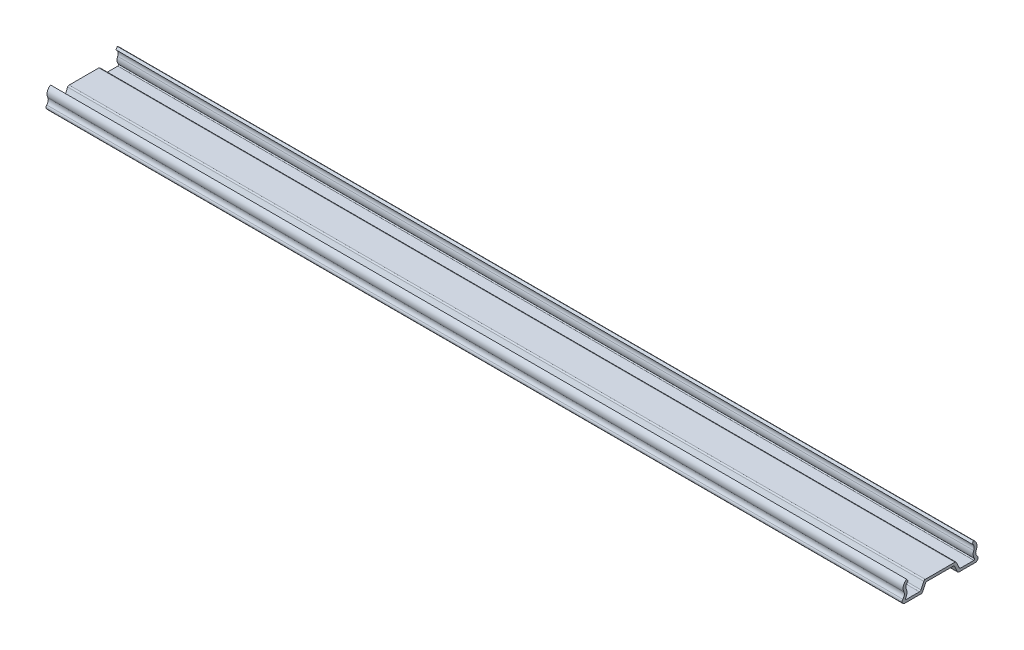
ISO-10303-21;
HEADER;
FILE_DESCRIPTION(('STEP AP214'),'2;1');
FILE_NAME('part.step','',(''),(''),'','','');
FILE_SCHEMA(('AUTOMOTIVE_DESIGN { 1 0 10303 214 1 1 1 1 }'));
ENDSEC;
DATA;
#1=APPLICATION_CONTEXT('core data for automotive mechanical design processes');
#2=APPLICATION_PROTOCOL_DEFINITION('international standard','automotive_design',2000,#1);
#3=PRODUCT_CONTEXT('',#1,'mechanical');
#4=PRODUCT('Part','Part','',(#3));
#5=PRODUCT_RELATED_PRODUCT_CATEGORY('part','',(#4));
#6=PRODUCT_DEFINITION_FORMATION('','',#4);
#7=PRODUCT_DEFINITION_CONTEXT('part definition',#1,'design');
#8=PRODUCT_DEFINITION('design','',#6,#7);
#9=PRODUCT_DEFINITION_SHAPE('','',#8);
#10=(LENGTH_UNIT() NAMED_UNIT(*) SI_UNIT(.MILLI.,.METRE.));
#11=(NAMED_UNIT(*) PLANE_ANGLE_UNIT() SI_UNIT($,.RADIAN.));
#12=(NAMED_UNIT(*) SI_UNIT($,.STERADIAN.) SOLID_ANGLE_UNIT());
#13=UNCERTAINTY_MEASURE_WITH_UNIT(LENGTH_MEASURE(1.E-05),#10,'distance_accuracy_value','');
#14=(GEOMETRIC_REPRESENTATION_CONTEXT(3) GLOBAL_UNCERTAINTY_ASSIGNED_CONTEXT((#13)) GLOBAL_UNIT_ASSIGNED_CONTEXT((#10,
#11,#12)) REPRESENTATION_CONTEXT('',''));
#15=CARTESIAN_POINT('',(0.,0.,0.));
#16=DIRECTION('',(0.,0.,1.));
#17=DIRECTION('',(1.,0.,0.));
#18=AXIS2_PLACEMENT_3D('',#15,#16,#17);
#19=CARTESIAN_POINT('',(0.,2.75348476488458,8.73241872004198));
#20=DIRECTION('',(1.,0.,0.));
#21=DIRECTION('',(0.,0.,-1.));
#22=AXIS2_PLACEMENT_3D('',#19,#20,#21);
#23=CYLINDRICAL_SURFACE('',#22,0.764864764885653);
#24=CARTESIAN_POINT('',(0.,2.75348476488458,8.73241872004198));
#25=DIRECTION('',(1.,0.,0.));
#26=DIRECTION('',(0.,0.,-1.));
#27=AXIS2_PLACEMENT_3D('',#24,#25,#26);
#28=CIRCLE('',#27,0.764864764885653);
#29=CARTESIAN_POINT('',(0.,1.98862,8.73241936002099));
#30=VERTEX_POINT('',#29);
#31=CARTESIAN_POINT('',(0.,2.43022725528312,8.03922127987804));
#32=VERTEX_POINT('',#31);
#33=EDGE_CURVE('E233',#30,#32,#28,.T.);
#34=ORIENTED_EDGE('',*,*,#33,.T.);
#35=DIRECTION('',(1.,0.,0.));
#36=VECTOR('',#35,1.);
#37=CARTESIAN_POINT('',(0.,2.43022725528312,8.03922127987804));
#38=LINE('',#37,#36);
#39=CARTESIAN_POINT('',(400.,2.43022725528312,8.03922127987804));
#40=VERTEX_POINT('',#39);
#41=EDGE_CURVE('E231',#40,#32,#38,.F.);
#42=ORIENTED_EDGE('',*,*,#41,.F.);
#43=CARTESIAN_POINT('',(400.,2.75348476488458,8.73241872004198));
#44=DIRECTION('',(1.,0.,0.));
#45=DIRECTION('',(0.,0.,-1.));
#46=AXIS2_PLACEMENT_3D('',#43,#44,#45);
#47=CIRCLE('',#46,0.764864764885653);
#48=CARTESIAN_POINT('',(400.,1.98862,8.73241936002099));
#49=VERTEX_POINT('',#48);
#50=EDGE_CURVE('E20',#40,#49,#47,.F.);
#51=ORIENTED_EDGE('',*,*,#50,.T.);
#52=DIRECTION('',(1.,0.,0.));
#53=VECTOR('',#52,1.);
#54=CARTESIAN_POINT('',(0.,1.98862,8.73242));
#55=LINE('',#54,#53);
#56=EDGE_CURVE('E228',#30,#49,#55,.T.);
#57=ORIENTED_EDGE('',*,*,#56,.F.);
#58=EDGE_LOOP('',(#34,#42,#51,#57));
#59=FACE_BOUND('',#58,.T.);
#60=ADVANCED_FACE('F17',(#59),#23,.T.);
#61=CARTESIAN_POINT('',(0.,4.92054224396635,6.03403471101577));
#62=DIRECTION('',(1.,0.,0.));
#63=DIRECTION('',(0.,0.,-1.));
#64=AXIS2_PLACEMENT_3D('',#61,#62,#63);
#65=CYLINDRICAL_SURFACE('',#64,0.764867756186452);
#66=CARTESIAN_POINT('',(0.,4.92054224396635,6.03403471101577));
#67=DIRECTION('',(1.,0.,0.));
#68=DIRECTION('',(0.,0.,-1.));
#69=AXIS2_PLACEMENT_3D('',#66,#67,#68);
#70=CIRCLE('',#69,0.764867756186452);
#71=CARTESIAN_POINT('',(0.,5.24378865712407,6.72724062619114));
#72=VERTEX_POINT('',#71);
#73=CARTESIAN_POINT('',(0.,5.68541,6.03405));
#74=VERTEX_POINT('',#73);
#75=EDGE_CURVE('E437',#72,#74,#70,.F.);
#76=ORIENTED_EDGE('',*,*,#75,.T.);
#77=DIRECTION('',(1.,0.,0.));
#78=VECTOR('',#77,1.);
#79=CARTESIAN_POINT('',(0.,5.68541,6.03405));
#80=LINE('',#79,#78);
#81=CARTESIAN_POINT('',(400.,5.68541,6.03405));
#82=VERTEX_POINT('',#81);
#83=EDGE_CURVE('E332',#82,#74,#80,.F.);
#84=ORIENTED_EDGE('',*,*,#83,.F.);
#85=CARTESIAN_POINT('',(400.,4.92054224396635,6.03403471101577));
#86=DIRECTION('',(1.,0.,0.));
#87=DIRECTION('',(0.,0.,-1.));
#88=AXIS2_PLACEMENT_3D('',#85,#86,#87);
#89=CIRCLE('',#88,0.764867756186452);
#90=CARTESIAN_POINT('',(400.,5.24378865712407,6.72724062619114));
#91=VERTEX_POINT('',#90);
#92=EDGE_CURVE('E439',#82,#91,#89,.T.);
#93=ORIENTED_EDGE('',*,*,#92,.T.);
#94=DIRECTION('',(1.,0.,0.));
#95=VECTOR('',#94,1.);
#96=CARTESIAN_POINT('',(0.,5.24378891450325,6.72724050617368));
#97=LINE('',#96,#95);
#98=EDGE_CURVE('E335',#72,#91,#97,.T.);
#99=ORIENTED_EDGE('',*,*,#98,.F.);
#100=EDGE_LOOP('',(#76,#84,#93,#99));
#101=FACE_BOUND('',#100,.T.);
#102=ADVANCED_FACE('F791',(#101),#65,.F.);
#103=CARTESIAN_POINT('',(0.,4.92052875068613,-6.24886077785425));
#104=DIRECTION('',(1.,0.,0.));
#105=DIRECTION('',(0.,0.,-1.));
#106=AXIS2_PLACEMENT_3D('',#103,#104,#105);
#107=CYLINDRICAL_SURFACE('',#106,0.764881249555406);
#108=CARTESIAN_POINT('',(0.,4.92052875068613,-6.24886077785425));
#109=DIRECTION('',(1.,0.,0.));
#110=DIRECTION('',(0.,0.,-1.));
#111=AXIS2_PLACEMENT_3D('',#108,#109,#110);
#112=CIRCLE('',#111,0.764881249555406);
#113=CARTESIAN_POINT('',(0.,5.68541,-6.24888));
#114=VERTEX_POINT('',#113);
#115=CARTESIAN_POINT('',(0.,5.24378975687758,-6.9420747764128));
#116=VERTEX_POINT('',#115);
#117=EDGE_CURVE('E433',#114,#116,#112,.F.);
#118=ORIENTED_EDGE('',*,*,#117,.T.);
#119=DIRECTION('',(1.,0.,0.));
#120=VECTOR('',#119,1.);
#121=CARTESIAN_POINT('',(0.,5.24378975687758,-6.9420747764128));
#122=LINE('',#121,#120);
#123=CARTESIAN_POINT('',(400.,5.24378975687758,-6.9420747764128));
#124=VERTEX_POINT('',#123);
#125=EDGE_CURVE('E326',#124,#116,#122,.F.);
#126=ORIENTED_EDGE('',*,*,#125,.F.);
#127=CARTESIAN_POINT('',(400.,4.92052875068613,-6.24886077785425));
#128=DIRECTION('',(1.,0.,0.));
#129=DIRECTION('',(0.,0.,-1.));
#130=AXIS2_PLACEMENT_3D('',#127,#128,#129);
#131=CIRCLE('',#130,0.764881249555406);
#132=CARTESIAN_POINT('',(400.,5.68541,-6.24888));
#133=VERTEX_POINT('',#132);
#134=EDGE_CURVE('E435',#124,#133,#131,.T.);
#135=ORIENTED_EDGE('',*,*,#134,.T.);
#136=DIRECTION('',(1.,0.,0.));
#137=VECTOR('',#136,1.);
#138=CARTESIAN_POINT('',(0.,5.68541,-6.24888));
#139=LINE('',#138,#137);
#140=EDGE_CURVE('E329',#114,#133,#139,.T.);
#141=ORIENTED_EDGE('',*,*,#140,.F.);
#142=EDGE_LOOP('',(#118,#126,#135,#141));
#143=FACE_BOUND('',#142,.T.);
#144=ADVANCED_FACE('F485',(#143),#107,.F.);
#145=CARTESIAN_POINT('',(0.,2.75348476483498,-8.94724872002753));
#146=DIRECTION('',(1.,0.,0.));
#147=DIRECTION('',(0.,0.,-1.));
#148=AXIS2_PLACEMENT_3D('',#145,#146,#147);
#149=CYLINDRICAL_SURFACE('',#148,0.764864764836053);
#150=CARTESIAN_POINT('',(0.,2.75348476483498,-8.94724872002753));
#151=DIRECTION('',(1.,0.,0.));
#152=DIRECTION('',(0.,0.,-1.));
#153=AXIS2_PLACEMENT_3D('',#150,#151,#152);
#154=CIRCLE('',#153,0.764864764836053);
#155=CARTESIAN_POINT('',(0.,2.43022819895883,-8.25405083983338));
#156=VERTEX_POINT('',#155);
#157=CARTESIAN_POINT('',(0.,1.98862,-8.94724936001376));
#158=VERTEX_POINT('',#157);
#159=EDGE_CURVE('E350',#156,#158,#154,.T.);
#160=ORIENTED_EDGE('',*,*,#159,.T.);
#161=DIRECTION('',(1.,0.,0.));
#162=VECTOR('',#161,1.);
#163=CARTESIAN_POINT('',(0.,1.98862,-8.94725));
#164=LINE('',#163,#162);
#165=CARTESIAN_POINT('',(400.,1.98862,-8.94724936001376));
#166=VERTEX_POINT('',#165);
#167=EDGE_CURVE('E322',#166,#158,#164,.F.);
#168=ORIENTED_EDGE('',*,*,#167,.F.);
#169=CARTESIAN_POINT('',(400.,2.75348476483498,-8.94724872002753));
#170=DIRECTION('',(1.,0.,0.));
#171=DIRECTION('',(0.,0.,-1.));
#172=AXIS2_PLACEMENT_3D('',#169,#170,#171);
#173=CIRCLE('',#172,0.764864764836053);
#174=CARTESIAN_POINT('',(400.,2.43022819895883,-8.25405083983338));
#175=VERTEX_POINT('',#174);
#176=EDGE_CURVE('E431',#166,#175,#173,.F.);
#177=ORIENTED_EDGE('',*,*,#176,.T.);
#178=DIRECTION('',(1.,0.,0.));
#179=VECTOR('',#178,1.);
#180=CARTESIAN_POINT('',(0.,2.43022819895883,-8.25405083983338));
#181=LINE('',#180,#179);
#182=EDGE_CURVE('E325',#156,#175,#181,.T.);
#183=ORIENTED_EDGE('',*,*,#182,.F.);
#184=EDGE_LOOP('',(#160,#168,#177,#183));
#185=FACE_BOUND('',#184,.T.);
#186=ADVANCED_FACE('F495',(#185),#149,.T.);
#187=CARTESIAN_POINT('',(0.,10.2675947470773,-15.0245964073222));
#188=DIRECTION('',(0.,0.564531156105848,0.825411760145077));
#189=DIRECTION('',(0.,-0.825411760145077,0.564531156105848));
#190=AXIS2_PLACEMENT_3D('',#187,#188,#189);
#191=PLANE('',#190);
#192=DIRECTION('',(0.,-0.825411760145077,0.564531156105848));
#193=VECTOR('',#192,1.);
#194=CARTESIAN_POINT('',(0.,10.2675947470773,-15.0245964073222));
#195=LINE('',#194,#193);
#196=CARTESIAN_POINT('',(0.,11.2943,-15.7268));
#197=VERTEX_POINT('',#196);
#198=CARTESIAN_POINT('',(0.,10.2675947470773,-15.0245964073222));
#199=VERTEX_POINT('',#198);
#200=EDGE_CURVE('E349',#197,#199,#195,.T.);
#201=ORIENTED_EDGE('',*,*,#200,.T.);
#202=DIRECTION('',(1.,0.,0.));
#203=VECTOR('',#202,1.);
#204=CARTESIAN_POINT('',(0.,10.2675947470773,-15.0245964073222));
#205=LINE('',#204,#203);
#206=CARTESIAN_POINT('',(400.,10.2675947470773,-15.0245964073222));
#207=VERTEX_POINT('',#206);
#208=EDGE_CURVE('E305',#207,#199,#205,.F.);
#209=ORIENTED_EDGE('',*,*,#208,.F.);
#210=DIRECTION('',(0.,-0.825411760145077,0.564531156105848));
#211=VECTOR('',#210,1.);
#212=CARTESIAN_POINT('',(400.,10.2675947470773,-15.0245964073222));
#213=LINE('',#212,#211);
#214=CARTESIAN_POINT('',(400.,11.2943,-15.7268));
#215=VERTEX_POINT('',#214);
#216=EDGE_CURVE('E347',#207,#215,#213,.F.);
#217=ORIENTED_EDGE('',*,*,#216,.T.);
#218=DIRECTION('',(1.,0.,0.));
#219=VECTOR('',#218,1.);
#220=CARTESIAN_POINT('',(0.,11.2943,-15.7268));
#221=LINE('',#220,#219);
#222=EDGE_CURVE('E310',#197,#215,#221,.T.);
#223=ORIENTED_EDGE('',*,*,#222,.F.);
#224=EDGE_LOOP('',(#201,#209,#217,#223));
#225=FACE_BOUND('',#224,.T.);
#226=ADVANCED_FACE('F513',(#225),#191,.T.);
#227=CARTESIAN_POINT('',(0.,3.59480990817467,-15.9056954702688));
#228=DIRECTION('',(1.,0.,0.));
#229=DIRECTION('',(0.,0.,-1.));
#230=AXIS2_PLACEMENT_3D('',#227,#228,#229);
#231=CYLINDRICAL_SURFACE('',#230,0.382429908201497);
#232=CARTESIAN_POINT('',(0.,3.59480990817467,-15.9056954702688));
#233=DIRECTION('',(1.,0.,0.));
#234=DIRECTION('',(0.,0.,-1.));
#235=AXIS2_PLACEMENT_3D('',#232,#233,#234);
#236=CIRCLE('',#235,0.382429908201497);
#237=CARTESIAN_POINT('',(0.,3.79491381009088,-16.2315958586161));
#238=VERTEX_POINT('',#237);
#239=CARTESIAN_POINT('',(0.,3.21238,-15.9056977351344));
#240=VERTEX_POINT('',#239);
#241=EDGE_CURVE('E427',#238,#240,#236,.F.);
#242=ORIENTED_EDGE('',*,*,#241,.T.);
#243=DIRECTION('',(1.,0.,0.));
#244=VECTOR('',#243,1.);
#245=CARTESIAN_POINT('',(0.,3.21238,-15.9057));
#246=LINE('',#245,#244);
#247=CARTESIAN_POINT('',(400.,3.21238,-15.9056977351344));
#248=VERTEX_POINT('',#247);
#249=EDGE_CURVE('E296',#248,#240,#246,.F.);
#250=ORIENTED_EDGE('',*,*,#249,.F.);
#251=CARTESIAN_POINT('',(400.,3.59480990817467,-15.9056954702688));
#252=DIRECTION('',(1.,0.,0.));
#253=DIRECTION('',(0.,0.,-1.));
#254=AXIS2_PLACEMENT_3D('',#251,#252,#253);
#255=CIRCLE('',#254,0.382429908201497);
#256=CARTESIAN_POINT('',(400.,3.79491381009088,-16.2315958586161));
#257=VERTEX_POINT('',#256);
#258=EDGE_CURVE('E352',#248,#257,#255,.T.);
#259=ORIENTED_EDGE('',*,*,#258,.T.);
#260=DIRECTION('',(1.,0.,0.));
#261=VECTOR('',#260,1.);
#262=CARTESIAN_POINT('',(0.,3.79491381009084,-16.2315958586161));
#263=LINE('',#262,#261);
#264=EDGE_CURVE('E299',#238,#257,#263,.T.);
#265=ORIENTED_EDGE('',*,*,#264,.F.);
#266=EDGE_LOOP('',(#242,#250,#259,#265));
#267=FACE_BOUND('',#266,.T.);
#268=ADVANCED_FACE('F525',(#267),#231,.F.);
#269=CARTESIAN_POINT('',(0.,3.97721582951668,-9.72686028631805));
#270=DIRECTION('',(1.,0.,0.));
#271=DIRECTION('',(0.,0.,-1.));
#272=AXIS2_PLACEMENT_3D('',#269,#270,#271);
#273=CYLINDRICAL_SURFACE('',#272,0.764835829578368);
#274=CARTESIAN_POINT('',(0.,3.97721582951668,-9.72686028631805));
#275=DIRECTION('',(1.,0.,0.));
#276=DIRECTION('',(0.,0.,-1.));
#277=AXIS2_PLACEMENT_3D('',#274,#275,#276);
#278=CIRCLE('',#277,0.764835829578368);
#279=CARTESIAN_POINT('',(0.,3.21238,-9.72686660021132));
#280=VERTEX_POINT('',#279);
#281=CARTESIAN_POINT('',(0.,3.65398683786433,-9.03368147452894));
#282=VERTEX_POINT('',#281);
#283=EDGE_CURVE('E423',#280,#282,#278,.F.);
#284=ORIENTED_EDGE('',*,*,#283,.T.);
#285=DIRECTION('',(1.,0.,0.));
#286=VECTOR('',#285,1.);
#287=CARTESIAN_POINT('',(0.,3.65399000545928,-9.0336799974543));
#288=LINE('',#287,#286);
#289=CARTESIAN_POINT('',(400.,3.65398683786433,-9.03368147452894));
#290=VERTEX_POINT('',#289);
#291=EDGE_CURVE('E284',#290,#282,#288,.F.);
#292=ORIENTED_EDGE('',*,*,#291,.F.);
#293=CARTESIAN_POINT('',(400.,3.97721582951668,-9.72686028631805));
#294=DIRECTION('',(1.,0.,0.));
#295=DIRECTION('',(0.,0.,-1.));
#296=AXIS2_PLACEMENT_3D('',#293,#294,#295);
#297=CIRCLE('',#296,0.764835829578368);
#298=CARTESIAN_POINT('',(400.,3.21238,-9.72686660021132));
#299=VERTEX_POINT('',#298);
#300=EDGE_CURVE('E425',#290,#299,#297,.T.);
#301=ORIENTED_EDGE('',*,*,#300,.T.);
#302=DIRECTION('',(1.,0.,0.));
#303=VECTOR('',#302,1.);
#304=CARTESIAN_POINT('',(0.,3.21238,-9.72687));
#305=LINE('',#304,#303);
#306=EDGE_CURVE('E295',#280,#299,#305,.T.);
#307=ORIENTED_EDGE('',*,*,#306,.F.);
#308=EDGE_LOOP('',(#284,#292,#301,#307));
#309=FACE_BOUND('',#308,.T.);
#310=ADVANCED_FACE('F535',(#309),#273,.F.);
#311=CARTESIAN_POINT('',(0.,3.59480990817467,15.6908954702688));
#312=DIRECTION('',(1.,0.,0.));
#313=DIRECTION('',(0.,0.,-1.));
#314=AXIS2_PLACEMENT_3D('',#311,#312,#313);
#315=CYLINDRICAL_SURFACE('',#314,0.382429908201497);
#316=CARTESIAN_POINT('',(0.,3.59480990817467,15.6908954702688));
#317=DIRECTION('',(1.,0.,0.));
#318=DIRECTION('',(0.,0.,-1.));
#319=AXIS2_PLACEMENT_3D('',#316,#317,#318);
#320=CIRCLE('',#319,0.382429908201497);
#321=CARTESIAN_POINT('',(0.,3.21238,15.6908977351344));
#322=VERTEX_POINT('',#321);
#323=CARTESIAN_POINT('',(0.,3.79491381009087,16.0167958586161));
#324=VERTEX_POINT('',#323);
#325=EDGE_CURVE('E344',#322,#324,#320,.F.);
#326=ORIENTED_EDGE('',*,*,#325,.T.);
#327=DIRECTION('',(1.,0.,0.));
#328=VECTOR('',#327,1.);
#329=CARTESIAN_POINT('',(0.,3.79491381009086,16.0167958586161));
#330=LINE('',#329,#328);
#331=CARTESIAN_POINT('',(400.,3.79491381009087,16.0167958586161));
#332=VERTEX_POINT('',#331);
#333=EDGE_CURVE('E275',#332,#324,#330,.F.);
#334=ORIENTED_EDGE('',*,*,#333,.F.);
#335=CARTESIAN_POINT('',(400.,3.59480990817467,15.6908954702688));
#336=DIRECTION('',(1.,0.,0.));
#337=DIRECTION('',(0.,0.,-1.));
#338=AXIS2_PLACEMENT_3D('',#335,#336,#337);
#339=CIRCLE('',#338,0.382429908201497);
#340=CARTESIAN_POINT('',(400.,3.21238,15.6908977351344));
#341=VERTEX_POINT('',#340);
#342=EDGE_CURVE('E421',#332,#341,#339,.T.);
#343=ORIENTED_EDGE('',*,*,#342,.T.);
#344=DIRECTION('',(1.,0.,0.));
#345=VECTOR('',#344,1.);
#346=CARTESIAN_POINT('',(0.,3.21238,15.6909));
#347=LINE('',#346,#345);
#348=EDGE_CURVE('E280',#322,#341,#347,.T.);
#349=ORIENTED_EDGE('',*,*,#348,.F.);
#350=EDGE_LOOP('',(#326,#334,#343,#349));
#351=FACE_BOUND('',#350,.T.);
#352=ADVANCED_FACE('F567',(#351),#315,.F.);
#353=CARTESIAN_POINT('',(0.,11.2943,15.512));
#354=DIRECTION('',(0.,0.564585925612465,-0.82537429848543));
#355=DIRECTION('',(0.,0.82537429848543,0.564585925612465));
#356=AXIS2_PLACEMENT_3D('',#353,#354,#355);
#357=PLANE('',#356);
#358=DIRECTION('',(0.,0.82537429848543,0.564585925612465));
#359=VECTOR('',#358,1.);
#360=CARTESIAN_POINT('',(0.,11.2943,15.512));
#361=LINE('',#360,#359);
#362=CARTESIAN_POINT('',(0.,10.2676404613512,14.8097276770302));
#363=VERTEX_POINT('',#362);
#364=CARTESIAN_POINT('',(0.,11.2943,15.512));
#365=VERTEX_POINT('',#364);
#366=EDGE_CURVE('E343',#363,#365,#361,.T.);
#367=ORIENTED_EDGE('',*,*,#366,.T.);
#368=DIRECTION('',(1.,0.,0.));
#369=VECTOR('',#368,1.);
#370=CARTESIAN_POINT('',(0.,11.2943,15.512));
#371=LINE('',#370,#369);
#372=CARTESIAN_POINT('',(400.,11.2943,15.512));
#373=VERTEX_POINT('',#372);
#374=EDGE_CURVE('E268',#373,#365,#371,.F.);
#375=ORIENTED_EDGE('',*,*,#374,.F.);
#376=DIRECTION('',(0.,0.82537429848543,0.564585925612465));
#377=VECTOR('',#376,1.);
#378=CARTESIAN_POINT('',(400.,11.2943,15.512));
#379=LINE('',#378,#377);
#380=CARTESIAN_POINT('',(400.,10.2676404613512,14.8097276770302));
#381=VERTEX_POINT('',#380);
#382=EDGE_CURVE('E341',#373,#381,#379,.F.);
#383=ORIENTED_EDGE('',*,*,#382,.T.);
#384=DIRECTION('',(1.,0.,0.));
#385=VECTOR('',#384,1.);
#386=CARTESIAN_POINT('',(0.,10.2676404613512,14.8097276770303));
#387=LINE('',#386,#385);
#388=EDGE_CURVE('E271',#363,#381,#387,.T.);
#389=ORIENTED_EDGE('',*,*,#388,.F.);
#390=EDGE_LOOP('',(#367,#375,#383,#389));
#391=FACE_BOUND('',#390,.T.);
#392=ADVANCED_FACE('F579',(#391),#357,.T.);
#393=CARTESIAN_POINT('',(0.,3.97721582951669,9.51203028631805));
#394=DIRECTION('',(1.,0.,0.));
#395=DIRECTION('',(0.,0.,-1.));
#396=AXIS2_PLACEMENT_3D('',#393,#394,#395);
#397=CYLINDRICAL_SURFACE('',#396,0.764835829578373);
#398=CARTESIAN_POINT('',(0.,3.97721582951669,9.51203028631805));
#399=DIRECTION('',(1.,0.,0.));
#400=DIRECTION('',(0.,0.,-1.));
#401=AXIS2_PLACEMENT_3D('',#398,#399,#400);
#402=CIRCLE('',#401,0.764835829578373);
#403=CARTESIAN_POINT('',(0.,3.65398683786433,8.81885147452893));
#404=VERTEX_POINT('',#403);
#405=CARTESIAN_POINT('',(0.,3.21238,9.51203660021132));
#406=VERTEX_POINT('',#405);
#407=EDGE_CURVE('E241',#404,#406,#402,.F.);
#408=ORIENTED_EDGE('',*,*,#407,.T.);
#409=DIRECTION('',(1.,0.,0.));
#410=VECTOR('',#409,1.);
#411=CARTESIAN_POINT('',(0.,3.21238,9.51204));
#412=LINE('',#411,#410);
#413=CARTESIAN_POINT('',(400.,3.21238,9.51203660021132));
#414=VERTEX_POINT('',#413);
#415=EDGE_CURVE('E281',#414,#406,#412,.F.);
#416=ORIENTED_EDGE('',*,*,#415,.F.);
#417=CARTESIAN_POINT('',(400.,3.97721582951669,9.51203028631805));
#418=DIRECTION('',(1.,0.,0.));
#419=DIRECTION('',(0.,0.,-1.));
#420=AXIS2_PLACEMENT_3D('',#417,#418,#419);
#421=CIRCLE('',#420,0.764835829578373);
#422=CARTESIAN_POINT('',(400.,3.65398683786433,8.81885147452893));
#423=VERTEX_POINT('',#422);
#424=EDGE_CURVE('E346',#414,#423,#421,.T.);
#425=ORIENTED_EDGE('',*,*,#424,.T.);
#426=DIRECTION('',(1.,0.,0.));
#427=VECTOR('',#426,1.);
#428=CARTESIAN_POINT('',(0.,3.65399000545928,8.8188499974543));
#429=LINE('',#428,#427);
#430=EDGE_CURVE('E265',#404,#423,#429,.T.);
#431=ORIENTED_EDGE('',*,*,#430,.F.);
#432=EDGE_LOOP('',(#408,#416,#425,#431));
#433=FACE_BOUND('',#432,.T.);
#434=ADVANCED_FACE('F557',(#433),#397,.F.);
#435=CARTESIAN_POINT('',(0.,1.98862,8.73242));
#436=DIRECTION('',(0.,-1.,0.));
#437=DIRECTION('',(0.,0.,-1.));
#438=AXIS2_PLACEMENT_3D('',#435,#436,#437);
#439=PLANE('',#438);
#440=DIRECTION('',(0.,0.,-1.));
#441=VECTOR('',#440,1.);
#442=CARTESIAN_POINT('',(0.,1.98862,0.));
#443=LINE('',#442,#441);
#444=CARTESIAN_POINT('',(0.,1.98862,16.3525));
#445=VERTEX_POINT('',#444);
#446=EDGE_CURVE('E240',#445,#30,#443,.T.);
#447=ORIENTED_EDGE('',*,*,#446,.T.);
#448=ORIENTED_EDGE('',*,*,#56,.T.);
#449=DIRECTION('',(0.,0.,-1.));
#450=VECTOR('',#449,1.);
#451=CARTESIAN_POINT('',(400.,1.98862,0.));
#452=LINE('',#451,#450);
#453=CARTESIAN_POINT('',(400.,1.98862,16.3525));
#454=VERTEX_POINT('',#453);
#455=EDGE_CURVE('E237',#454,#49,#452,.T.);
#456=ORIENTED_EDGE('',*,*,#455,.F.);
#457=DIRECTION('',(1.,0.,0.));
#458=VECTOR('',#457,1.);
#459=CARTESIAN_POINT('',(0.,1.98862,16.3525));
#460=LINE('',#459,#458);
#461=EDGE_CURVE('E262',#445,#454,#460,.T.);
#462=ORIENTED_EDGE('',*,*,#461,.F.);
#463=EDGE_LOOP('',(#447,#448,#456,#462));
#464=FACE_BOUND('',#463,.T.);
#465=ADVANCED_FACE('F236',(#464),#439,.T.);
#466=CARTESIAN_POINT('',(0.,5.24378891450325,6.72724050617368));
#467=DIRECTION('',(0.,-0.422617051332256,-0.906308351458393));
#468=DIRECTION('',(0.,0.906308351458393,-0.422617051332256));
#469=AXIS2_PLACEMENT_3D('',#466,#467,#468);
#470=PLANE('',#469);
#471=DIRECTION('',(0.,0.906308351458392,-0.422617051332257));
#472=VECTOR('',#471,1.);
#473=CARTESIAN_POINT('',(0.,2.43022725528312,8.03922127987804));
#474=LINE('',#473,#472);
#475=EDGE_CURVE('E444',#32,#72,#474,.T.);
#476=ORIENTED_EDGE('',*,*,#475,.T.);
#477=ORIENTED_EDGE('',*,*,#98,.T.);
#478=DIRECTION('',(0.,0.906308351458392,-0.422617051332257));
#479=VECTOR('',#478,1.);
#480=CARTESIAN_POINT('',(400.,2.43022725528312,8.03922127987804));
#481=LINE('',#480,#479);
#482=EDGE_CURVE('E247',#40,#91,#481,.T.);
#483=ORIENTED_EDGE('',*,*,#482,.F.);
#484=ORIENTED_EDGE('',*,*,#41,.T.);
#485=EDGE_LOOP('',(#476,#477,#483,#484));
#486=FACE_BOUND('',#485,.T.);
#487=ADVANCED_FACE('F443',(#486),#470,.T.);
#488=CARTESIAN_POINT('',(0.,5.68541,-6.24888));
#489=DIRECTION('',(0.,-1.,0.));
#490=DIRECTION('',(0.,0.,-1.));
#491=AXIS2_PLACEMENT_3D('',#488,#489,#490);
#492=PLANE('',#491);
#493=DIRECTION('',(0.,0.,-1.));
#494=VECTOR('',#493,1.);
#495=CARTESIAN_POINT('',(0.,5.68541,0.));
#496=LINE('',#495,#494);
#497=EDGE_CURVE('E449',#74,#114,#496,.T.);
#498=ORIENTED_EDGE('',*,*,#497,.T.);
#499=ORIENTED_EDGE('',*,*,#140,.T.);
#500=DIRECTION('',(0.,0.,-1.));
#501=VECTOR('',#500,1.);
#502=CARTESIAN_POINT('',(400.,5.68541,0.));
#503=LINE('',#502,#501);
#504=EDGE_CURVE('E249',#82,#133,#503,.T.);
#505=ORIENTED_EDGE('',*,*,#504,.F.);
#506=ORIENTED_EDGE('',*,*,#83,.T.);
#507=EDGE_LOOP('',(#498,#499,#505,#506));
#508=FACE_BOUND('',#507,.T.);
#509=ADVANCED_FACE('F482',(#508),#492,.T.);
#510=CARTESIAN_POINT('',(0.,2.43022819895883,-8.25405083983338));
#511=DIRECTION('',(0.,-0.422615817541055,0.90630892678165));
#512=DIRECTION('',(0.,-0.90630892678165,-0.422615817541055));
#513=AXIS2_PLACEMENT_3D('',#510,#511,#512);
#514=PLANE('',#513);
#515=DIRECTION('',(0.,-0.90630892678165,-0.422615817541055));
#516=VECTOR('',#515,1.);
#517=CARTESIAN_POINT('',(0.,5.24378975687758,-6.9420747764128));
#518=LINE('',#517,#516);
#519=EDGE_CURVE('E452',#116,#156,#518,.T.);
#520=ORIENTED_EDGE('',*,*,#519,.T.);
#521=ORIENTED_EDGE('',*,*,#182,.T.);
#522=DIRECTION('',(0.,-0.90630892678165,-0.422615817541055));
#523=VECTOR('',#522,1.);
#524=CARTESIAN_POINT('',(400.,5.24378975687758,-6.9420747764128));
#525=LINE('',#524,#523);
#526=EDGE_CURVE('E475',#124,#175,#525,.T.);
#527=ORIENTED_EDGE('',*,*,#526,.F.);
#528=ORIENTED_EDGE('',*,*,#125,.T.);
#529=EDGE_LOOP('',(#520,#521,#527,#528));
#530=FACE_BOUND('',#529,.T.);
#531=ADVANCED_FACE('F490',(#530),#514,.T.);
#532=CARTESIAN_POINT('',(0.,1.98862,-16.5673));
#533=DIRECTION('',(0.,-1.,0.));
#534=DIRECTION('',(0.,0.,-1.));
#535=AXIS2_PLACEMENT_3D('',#532,#533,#534);
#536=PLANE('',#535);
#537=DIRECTION('',(0.,0.,-1.));
#538=VECTOR('',#537,1.);
#539=CARTESIAN_POINT('',(0.,1.98862,0.));
#540=LINE('',#539,#538);
#541=CARTESIAN_POINT('',(0.,1.98862,-16.5673));
#542=VERTEX_POINT('',#541);
#543=EDGE_CURVE('E387',#158,#542,#540,.T.);
#544=ORIENTED_EDGE('',*,*,#543,.T.);
#545=DIRECTION('',(1.,0.,0.));
#546=VECTOR('',#545,1.);
#547=CARTESIAN_POINT('',(0.,1.98862,-16.5673));
#548=LINE('',#547,#546);
#549=CARTESIAN_POINT('',(400.,1.98862,-16.5673));
#550=VERTEX_POINT('',#549);
#551=EDGE_CURVE('E319',#550,#542,#548,.F.);
#552=ORIENTED_EDGE('',*,*,#551,.F.);
#553=DIRECTION('',(0.,0.,-1.));
#554=VECTOR('',#553,1.);
#555=CARTESIAN_POINT('',(400.,1.98862,0.));
#556=LINE('',#555,#554);
#557=EDGE_CURVE('E415',#166,#550,#556,.T.);
#558=ORIENTED_EDGE('',*,*,#557,.F.);
#559=ORIENTED_EDGE('',*,*,#167,.T.);
#560=EDGE_LOOP('',(#544,#552,#558,#559));
#561=FACE_BOUND('',#560,.T.);
#562=ADVANCED_FACE('F498',(#561),#536,.T.);
#563=CARTESIAN_POINT('',(0.,3.26055,-16.5673));
#564=DIRECTION('',(1.,0.,0.));
#565=DIRECTION('',(0.,0.,-1.));
#566=AXIS2_PLACEMENT_3D('',#563,#564,#565);
#567=CYLINDRICAL_SURFACE('',#566,1.27193);
#568=CARTESIAN_POINT('',(0.,3.26055,-16.5673));
#569=DIRECTION('',(1.,0.,0.));
#570=DIRECTION('',(0.,0.,-1.));
#571=AXIS2_PLACEMENT_3D('',#568,#569,#570);
#572=CIRCLE('',#571,1.27193);
#573=CARTESIAN_POINT('',(0.,4.10281094678863,-17.5204014754027));
#574=VERTEX_POINT('',#573);
#575=EDGE_CURVE('E385',#542,#574,#572,.T.);
#576=ORIENTED_EDGE('',*,*,#575,.T.);
#577=DIRECTION('',(1.,0.,0.));
#578=VECTOR('',#577,1.);
#579=CARTESIAN_POINT('',(0.,4.10281094678863,-17.5204014754027));
#580=LINE('',#579,#578);
#581=CARTESIAN_POINT('',(400.,4.10281094678864,-17.5204014754027));
#582=VERTEX_POINT('',#581);
#583=EDGE_CURVE('E314',#582,#574,#580,.F.);
#584=ORIENTED_EDGE('',*,*,#583,.F.);
#585=CARTESIAN_POINT('',(400.,3.26055,-16.5673));
#586=DIRECTION('',(1.,0.,0.));
#587=DIRECTION('',(0.,0.,-1.));
#588=AXIS2_PLACEMENT_3D('',#585,#586,#587);
#589=CIRCLE('',#588,1.27193);
#590=EDGE_CURVE('E413',#550,#582,#589,.T.);
#591=ORIENTED_EDGE('',*,*,#590,.F.);
#592=ORIENTED_EDGE('',*,*,#551,.T.);
#593=EDGE_LOOP('',(#576,#584,#591,#592));
#594=FACE_BOUND('',#593,.T.);
#595=ADVANCED_FACE('F502',(#594),#567,.T.);
#596=CARTESIAN_POINT('',(0.,5.85806,-19.236));
#597=DIRECTION('',(1.,0.,0.));
#598=DIRECTION('',(0.,0.,-1.));
#599=AXIS2_PLACEMENT_3D('',#596,#597,#598);
#600=CYLINDRICAL_SURFACE('',#599,2.45442);
#601=CARTESIAN_POINT('',(0.,5.85806,-19.236));
#602=DIRECTION('',(1.,0.,0.));
#603=DIRECTION('',(0.,0.,-1.));
#604=AXIS2_PLACEMENT_3D('',#601,#602,#603);
#605=CIRCLE('',#604,2.45442);
#606=CARTESIAN_POINT('',(0.,6.72992755742055,-16.9416537971096));
#607=VERTEX_POINT('',#606);
#608=EDGE_CURVE('E383',#574,#607,#605,.F.);
#609=ORIENTED_EDGE('',*,*,#608,.T.);
#610=DIRECTION('',(1.,0.,0.));
#611=VECTOR('',#610,1.);
#612=CARTESIAN_POINT('',(0.,6.72992755742054,-16.9416537971096));
#613=LINE('',#612,#611);
#614=CARTESIAN_POINT('',(400.,6.72992755742055,-16.9416537971096));
#615=VERTEX_POINT('',#614);
#616=EDGE_CURVE('E311',#615,#607,#613,.F.);
#617=ORIENTED_EDGE('',*,*,#616,.F.);
#618=CARTESIAN_POINT('',(400.,5.85806,-19.236));
#619=DIRECTION('',(1.,0.,0.));
#620=DIRECTION('',(0.,0.,-1.));
#621=AXIS2_PLACEMENT_3D('',#618,#619,#620);
#622=CIRCLE('',#621,2.45442);
#623=EDGE_CURVE('E410',#582,#615,#622,.F.);
#624=ORIENTED_EDGE('',*,*,#623,.F.);
#625=ORIENTED_EDGE('',*,*,#583,.T.);
#626=EDGE_LOOP('',(#609,#617,#624,#625));
#627=FACE_BOUND('',#626,.T.);
#628=ADVANCED_FACE('F506',(#627),#600,.F.);
#629=CARTESIAN_POINT('',(0.,8.38658266188493,-13.9840206445952));
#630=DIRECTION('',(1.,0.,0.));
#631=DIRECTION('',(0.,0.,-1.));
#632=AXIS2_PLACEMENT_3D('',#629,#630,#631);
#633=CYLINDRICAL_SURFACE('',#632,3.39);
#634=CARTESIAN_POINT('',(0.,8.38658266188493,-13.9840206445952));
#635=DIRECTION('',(1.,0.,0.));
#636=DIRECTION('',(0.,0.,-1.));
#637=AXIS2_PLACEMENT_3D('',#634,#635,#636);
#638=CIRCLE('',#637,3.39);
#639=EDGE_CURVE('E380',#607,#197,#638,.T.);
#640=ORIENTED_EDGE('',*,*,#639,.T.);
#641=ORIENTED_EDGE('',*,*,#222,.T.);
#642=CARTESIAN_POINT('',(400.,8.38658266188493,-13.9840206445952));
#643=DIRECTION('',(1.,0.,0.));
#644=DIRECTION('',(0.,0.,-1.));
#645=AXIS2_PLACEMENT_3D('',#642,#643,#644);
#646=CIRCLE('',#645,3.39);
#647=EDGE_CURVE('E407',#615,#215,#646,.T.);
#648=ORIENTED_EDGE('',*,*,#647,.F.);
#649=ORIENTED_EDGE('',*,*,#616,.T.);
#650=EDGE_LOOP('',(#640,#641,#648,#649));
#651=FACE_BOUND('',#650,.T.);
#652=ADVANCED_FACE('F510',(#651),#633,.T.);
#653=CARTESIAN_POINT('',(0.,8.29737,-13.7141));
#654=DIRECTION('',(1.,0.,0.));
#655=DIRECTION('',(0.,0.,-1.));
#656=AXIS2_PLACEMENT_3D('',#653,#654,#655);
#657=CYLINDRICAL_SURFACE('',#656,2.36626);
#658=CARTESIAN_POINT('',(0.,8.29737,-13.7141));
#659=DIRECTION('',(1.,0.,0.));
#660=DIRECTION('',(0.,0.,-1.));
#661=AXIS2_PLACEMENT_3D('',#658,#659,#660);
#662=CIRCLE('',#661,2.36626);
#663=CARTESIAN_POINT('',(0.,7.2402630737076,-15.8311052749071));
#664=VERTEX_POINT('',#663);
#665=EDGE_CURVE('E378',#199,#664,#662,.F.);
#666=ORIENTED_EDGE('',*,*,#665,.T.);
#667=DIRECTION('',(1.,0.,0.));
#668=VECTOR('',#667,1.);
#669=CARTESIAN_POINT('',(0.,7.24026307370758,-15.8311052749071));
#670=LINE('',#669,#668);
#671=CARTESIAN_POINT('',(400.,7.24026307370761,-15.8311052749071));
#672=VERTEX_POINT('',#671);
#673=EDGE_CURVE('E302',#672,#664,#670,.F.);
#674=ORIENTED_EDGE('',*,*,#673,.F.);
#675=CARTESIAN_POINT('',(400.,8.29737,-13.7141));
#676=DIRECTION('',(1.,0.,0.));
#677=DIRECTION('',(0.,0.,-1.));
#678=AXIS2_PLACEMENT_3D('',#675,#676,#677);
#679=CIRCLE('',#678,2.36626);
#680=EDGE_CURVE('E404',#207,#672,#679,.F.);
#681=ORIENTED_EDGE('',*,*,#680,.F.);
#682=ORIENTED_EDGE('',*,*,#208,.T.);
#683=EDGE_LOOP('',(#666,#674,#681,#682));
#684=FACE_BOUND('',#683,.T.);
#685=ADVANCED_FACE('F518',(#684),#657,.F.);
#686=CARTESIAN_POINT('',(0.,5.88824000000001,-19.22));
#687=DIRECTION('',(1.,0.,0.));
#688=DIRECTION('',(0.,0.,-1.));
#689=AXIS2_PLACEMENT_3D('',#686,#687,#688);
#690=CYLINDRICAL_SURFACE('',#689,3.64864);
#691=CARTESIAN_POINT('',(0.,5.88824000000001,-19.22));
#692=DIRECTION('',(1.,0.,0.));
#693=DIRECTION('',(0.,0.,-1.));
#694=AXIS2_PLACEMENT_3D('',#691,#692,#693);
#695=CIRCLE('',#694,3.64864);
#696=EDGE_CURVE('E374',#664,#238,#695,.T.);
#697=ORIENTED_EDGE('',*,*,#696,.T.);
#698=ORIENTED_EDGE('',*,*,#264,.T.);
#699=CARTESIAN_POINT('',(400.,5.88824000000001,-19.22));
#700=DIRECTION('',(1.,0.,0.));
#701=DIRECTION('',(0.,0.,-1.));
#702=AXIS2_PLACEMENT_3D('',#699,#700,#701);
#703=CIRCLE('',#702,3.64864);
#704=EDGE_CURVE('E400',#672,#257,#703,.T.);
#705=ORIENTED_EDGE('',*,*,#704,.F.);
#706=ORIENTED_EDGE('',*,*,#673,.T.);
#707=EDGE_LOOP('',(#697,#698,#705,#706));
#708=FACE_BOUND('',#707,.T.);
#709=ADVANCED_FACE('F522',(#708),#690,.T.);
#710=CARTESIAN_POINT('',(0.,3.21238,-9.72687));
#711=DIRECTION('',(0.,1.,0.));
#712=DIRECTION('',(0.,0.,1.));
#713=AXIS2_PLACEMENT_3D('',#710,#711,#712);
#714=PLANE('',#713);
#715=DIRECTION('',(0.,0.,-1.));
#716=VECTOR('',#715,1.);
#717=CARTESIAN_POINT('',(0.,3.21238,0.));
#718=LINE('',#717,#716);
#719=EDGE_CURVE('E377',#240,#280,#718,.F.);
#720=ORIENTED_EDGE('',*,*,#719,.T.);
#721=ORIENTED_EDGE('',*,*,#306,.T.);
#722=DIRECTION('',(0.,0.,-1.));
#723=VECTOR('',#722,1.);
#724=CARTESIAN_POINT('',(400.,3.21238,0.));
#725=LINE('',#724,#723);
#726=EDGE_CURVE('E403',#248,#299,#725,.F.);
#727=ORIENTED_EDGE('',*,*,#726,.F.);
#728=ORIENTED_EDGE('',*,*,#249,.T.);
#729=EDGE_LOOP('',(#720,#721,#727,#728));
#730=FACE_BOUND('',#729,.T.);
#731=ADVANCED_FACE('F531',(#730),#714,.T.);
#732=CARTESIAN_POINT('',(0.,6.46755999454072,-7.7216900025457));
#733=DIRECTION('',(0.,0.422618463421166,-0.906307692991477));
#734=DIRECTION('',(0.,0.906307692991477,0.422618463421166));
#735=AXIS2_PLACEMENT_3D('',#732,#733,#734);
#736=PLANE('',#735);
#737=DIRECTION('',(0.,0.906307692991477,0.422618463421166));
#738=VECTOR('',#737,1.);
#739=CARTESIAN_POINT('',(0.,3.65399000545928,-9.0336799974543));
#740=LINE('',#739,#738);
#741=CARTESIAN_POINT('',(0.,6.46756316213567,-7.72168852547107));
#742=VERTEX_POINT('',#741);
#743=EDGE_CURVE('E373',#282,#742,#740,.T.);
#744=ORIENTED_EDGE('',*,*,#743,.T.);
#745=DIRECTION('',(1.,0.,0.));
#746=VECTOR('',#745,1.);
#747=CARTESIAN_POINT('',(0.,6.46755999454072,-7.7216900025457));
#748=LINE('',#747,#746);
#749=CARTESIAN_POINT('',(400.,6.46756316213567,-7.72168852547107));
#750=VERTEX_POINT('',#749);
#751=EDGE_CURVE('E289',#750,#742,#748,.F.);
#752=ORIENTED_EDGE('',*,*,#751,.F.);
#753=DIRECTION('',(0.,0.906307692991477,0.422618463421166));
#754=VECTOR('',#753,1.);
#755=CARTESIAN_POINT('',(400.,3.65399000545928,-9.0336799974543));
#756=LINE('',#755,#754);
#757=EDGE_CURVE('E469',#290,#750,#756,.T.);
#758=ORIENTED_EDGE('',*,*,#757,.F.);
#759=ORIENTED_EDGE('',*,*,#291,.T.);
#760=EDGE_LOOP('',(#744,#752,#758,#759));
#761=FACE_BOUND('',#760,.T.);
#762=ADVANCED_FACE('F540',(#761),#736,.T.);
#763=CARTESIAN_POINT('',(0.,3.21238,15.6909));
#764=DIRECTION('',(0.,1.,0.));
#765=DIRECTION('',(0.,0.,1.));
#766=AXIS2_PLACEMENT_3D('',#763,#764,#765);
#767=PLANE('',#766);
#768=DIRECTION('',(0.,0.,-1.));
#769=VECTOR('',#768,1.);
#770=CARTESIAN_POINT('',(0.,3.21238,0.));
#771=LINE('',#770,#769);
#772=EDGE_CURVE('E369',#406,#322,#771,.F.);
#773=ORIENTED_EDGE('',*,*,#772,.T.);
#774=ORIENTED_EDGE('',*,*,#348,.T.);
#775=DIRECTION('',(0.,0.,-1.));
#776=VECTOR('',#775,1.);
#777=CARTESIAN_POINT('',(400.,3.21238,0.));
#778=LINE('',#777,#776);
#779=EDGE_CURVE('E399',#414,#341,#778,.F.);
#780=ORIENTED_EDGE('',*,*,#779,.F.);
#781=ORIENTED_EDGE('',*,*,#415,.T.);
#782=EDGE_LOOP('',(#773,#774,#780,#781));
#783=FACE_BOUND('',#782,.T.);
#784=ADVANCED_FACE('F562',(#783),#767,.T.);
#785=CARTESIAN_POINT('',(0.,5.88824,19.0052));
#786=DIRECTION('',(1.,0.,0.));
#787=DIRECTION('',(0.,0.,-1.));
#788=AXIS2_PLACEMENT_3D('',#785,#786,#787);
#789=CYLINDRICAL_SURFACE('',#788,3.64864);
#790=CARTESIAN_POINT('',(0.,5.88824,19.0052));
#791=DIRECTION('',(1.,0.,0.));
#792=DIRECTION('',(0.,0.,-1.));
#793=AXIS2_PLACEMENT_3D('',#790,#791,#792);
#794=CIRCLE('',#793,3.64864);
#795=CARTESIAN_POINT('',(0.,7.24026307370761,15.6163052749071));
#796=VERTEX_POINT('',#795);
#797=EDGE_CURVE('E367',#324,#796,#794,.T.);
#798=ORIENTED_EDGE('',*,*,#797,.T.);
#799=DIRECTION('',(1.,0.,0.));
#800=VECTOR('',#799,1.);
#801=CARTESIAN_POINT('',(0.,7.24026307370759,15.6163052749071));
#802=LINE('',#801,#800);
#803=CARTESIAN_POINT('',(400.,7.24026307370761,15.6163052749071));
#804=VERTEX_POINT('',#803);
#805=EDGE_CURVE('E272',#804,#796,#802,.F.);
#806=ORIENTED_EDGE('',*,*,#805,.F.);
#807=CARTESIAN_POINT('',(400.,5.88824,19.0052));
#808=DIRECTION('',(1.,0.,0.));
#809=DIRECTION('',(0.,0.,-1.));
#810=AXIS2_PLACEMENT_3D('',#807,#808,#809);
#811=CIRCLE('',#810,3.64864);
#812=EDGE_CURVE('E396',#332,#804,#811,.T.);
#813=ORIENTED_EDGE('',*,*,#812,.F.);
#814=ORIENTED_EDGE('',*,*,#333,.T.);
#815=EDGE_LOOP('',(#798,#806,#813,#814));
#816=FACE_BOUND('',#815,.T.);
#817=ADVANCED_FACE('F570',(#816),#789,.T.);
#818=CARTESIAN_POINT('',(0.,8.29737000000001,13.4993));
#819=DIRECTION('',(1.,0.,0.));
#820=DIRECTION('',(0.,0.,-1.));
#821=AXIS2_PLACEMENT_3D('',#818,#819,#820);
#822=CYLINDRICAL_SURFACE('',#821,2.36626);
#823=CARTESIAN_POINT('',(0.,8.29737000000001,13.4993));
#824=DIRECTION('',(1.,0.,0.));
#825=DIRECTION('',(0.,0.,-1.));
#826=AXIS2_PLACEMENT_3D('',#823,#824,#825);
#827=CIRCLE('',#826,2.36626);
#828=EDGE_CURVE('E364',#796,#363,#827,.F.);
#829=ORIENTED_EDGE('',*,*,#828,.T.);
#830=ORIENTED_EDGE('',*,*,#388,.T.);
#831=CARTESIAN_POINT('',(400.,8.29737000000001,13.4993));
#832=DIRECTION('',(1.,0.,0.));
#833=DIRECTION('',(0.,0.,-1.));
#834=AXIS2_PLACEMENT_3D('',#831,#832,#833);
#835=CIRCLE('',#834,2.36626);
#836=EDGE_CURVE('E393',#804,#381,#835,.F.);
#837=ORIENTED_EDGE('',*,*,#836,.F.);
#838=ORIENTED_EDGE('',*,*,#805,.T.);
#839=EDGE_LOOP('',(#829,#830,#837,#838));
#840=FACE_BOUND('',#839,.T.);
#841=ADVANCED_FACE('F574',(#840),#822,.F.);
#842=CARTESIAN_POINT('',(0.,8.38657997789966,13.7692251226631));
#843=DIRECTION('',(1.,0.,0.));
#844=DIRECTION('',(0.,0.,-1.));
#845=AXIS2_PLACEMENT_3D('',#842,#843,#844);
#846=CYLINDRICAL_SURFACE('',#845,3.39);
#847=CARTESIAN_POINT('',(0.,8.38657997789966,13.7692251226631));
#848=DIRECTION('',(1.,0.,0.));
#849=DIRECTION('',(0.,0.,-1.));
#850=AXIS2_PLACEMENT_3D('',#847,#848,#849);
#851=CIRCLE('',#850,3.39);
#852=CARTESIAN_POINT('',(0.,6.72989435229662,16.7268411792059));
#853=VERTEX_POINT('',#852);
#854=EDGE_CURVE('E362',#365,#853,#851,.T.);
#855=ORIENTED_EDGE('',*,*,#854,.T.);
#856=DIRECTION('',(1.,0.,0.));
#857=VECTOR('',#856,1.);
#858=CARTESIAN_POINT('',(0.,6.72989435229662,16.7268411792059));
#859=LINE('',#858,#857);
#860=CARTESIAN_POINT('',(400.,6.72989435229662,16.7268411792059));
#861=VERTEX_POINT('',#860);
#862=EDGE_CURVE('E263',#861,#853,#859,.F.);
#863=ORIENTED_EDGE('',*,*,#862,.F.);
#864=CARTESIAN_POINT('',(400.,8.38657997789966,13.7692251226631));
#865=DIRECTION('',(1.,0.,0.));
#866=DIRECTION('',(0.,0.,-1.));
#867=AXIS2_PLACEMENT_3D('',#864,#865,#866);
#868=CIRCLE('',#867,3.39);
#869=EDGE_CURVE('E390',#373,#861,#868,.T.);
#870=ORIENTED_EDGE('',*,*,#869,.F.);
#871=ORIENTED_EDGE('',*,*,#374,.T.);
#872=EDGE_LOOP('',(#855,#863,#870,#871));
#873=FACE_BOUND('',#872,.T.);
#874=ADVANCED_FACE('F582',(#873),#846,.T.);
#875=CARTESIAN_POINT('',(0.,5.85806,19.0212));
#876=DIRECTION('',(1.,0.,0.));
#877=DIRECTION('',(0.,0.,-1.));
#878=AXIS2_PLACEMENT_3D('',#875,#876,#877);
#879=CYLINDRICAL_SURFACE('',#878,2.45441999999999);
#880=CARTESIAN_POINT('',(0.,5.85806,19.0212));
#881=DIRECTION('',(1.,0.,0.));
#882=DIRECTION('',(0.,0.,-1.));
#883=AXIS2_PLACEMENT_3D('',#880,#881,#882);
#884=CIRCLE('',#883,2.45441999999999);
#885=CARTESIAN_POINT('',(0.,4.10281094678864,17.3056014754026));
#886=VERTEX_POINT('',#885);
#887=EDGE_CURVE('E360',#853,#886,#884,.F.);
#888=ORIENTED_EDGE('',*,*,#887,.T.);
#889=DIRECTION('',(1.,0.,0.));
#890=VECTOR('',#889,1.);
#891=CARTESIAN_POINT('',(0.,4.10281094678863,17.3056014754027));
#892=LINE('',#891,#890);
#893=CARTESIAN_POINT('',(400.,4.10281094678865,17.3056014754026));
#894=VERTEX_POINT('',#893);
#895=EDGE_CURVE('E259',#894,#886,#892,.F.);
#896=ORIENTED_EDGE('',*,*,#895,.F.);
#897=CARTESIAN_POINT('',(400.,5.85806,19.0212));
#898=DIRECTION('',(1.,0.,0.));
#899=DIRECTION('',(0.,0.,-1.));
#900=AXIS2_PLACEMENT_3D('',#897,#898,#899);
#901=CIRCLE('',#900,2.45441999999999);
#902=EDGE_CURVE('E251',#861,#894,#901,.F.);
#903=ORIENTED_EDGE('',*,*,#902,.F.);
#904=ORIENTED_EDGE('',*,*,#862,.T.);
#905=EDGE_LOOP('',(#888,#896,#903,#904));
#906=FACE_BOUND('',#905,.T.);
#907=ADVANCED_FACE('F585',(#906),#879,.F.);
#908=CARTESIAN_POINT('',(0.,3.26055,16.3525));
#909=DIRECTION('',(1.,0.,0.));
#910=DIRECTION('',(0.,0.,-1.));
#911=AXIS2_PLACEMENT_3D('',#908,#909,#910);
#912=CYLINDRICAL_SURFACE('',#911,1.27193);
#913=CARTESIAN_POINT('',(0.,3.26055,16.3525));
#914=DIRECTION('',(1.,0.,0.));
#915=DIRECTION('',(0.,0.,-1.));
#916=AXIS2_PLACEMENT_3D('',#913,#914,#915);
#917=CIRCLE('',#916,1.27193);
#918=EDGE_CURVE('E357',#886,#445,#917,.T.);
#919=ORIENTED_EDGE('',*,*,#918,.T.);
#920=ORIENTED_EDGE('',*,*,#461,.T.);
#921=CARTESIAN_POINT('',(400.,3.26055,16.3525));
#922=DIRECTION('',(1.,0.,0.));
#923=DIRECTION('',(0.,0.,-1.));
#924=AXIS2_PLACEMENT_3D('',#921,#922,#923);
#925=CIRCLE('',#924,1.27193);
#926=EDGE_CURVE('E246',#894,#454,#925,.T.);
#927=ORIENTED_EDGE('',*,*,#926,.F.);
#928=ORIENTED_EDGE('',*,*,#895,.T.);
#929=EDGE_LOOP('',(#919,#920,#927,#928));
#930=FACE_BOUND('',#929,.T.);
#931=ADVANCED_FACE('F588',(#930),#912,.T.);
#932=CARTESIAN_POINT('',(0.,3.65399000545928,8.8188499974543));
#933=DIRECTION('',(0.,0.422618463421165,0.906307692991477));
#934=DIRECTION('',(0.,-0.906307692991477,0.422618463421165));
#935=AXIS2_PLACEMENT_3D('',#932,#933,#934);
#936=PLANE('',#935);
#937=DIRECTION('',(0.,-0.906307692991477,0.422618463421165));
#938=VECTOR('',#937,1.);
#939=CARTESIAN_POINT('',(0.,6.46755999454072,7.50686000254571));
#940=LINE('',#939,#938);
#941=CARTESIAN_POINT('',(0.,6.46756316213567,7.50685852547107));
#942=VERTEX_POINT('',#941);
#943=EDGE_CURVE('E372',#942,#404,#940,.T.);
#944=ORIENTED_EDGE('',*,*,#943,.T.);
#945=ORIENTED_EDGE('',*,*,#430,.T.);
#946=DIRECTION('',(0.,-0.906307692991477,0.422618463421165));
#947=VECTOR('',#946,1.);
#948=CARTESIAN_POINT('',(400.,6.46755999454072,7.50686000254571));
#949=LINE('',#948,#947);
#950=CARTESIAN_POINT('',(400.,6.46756316213567,7.50685852547107));
#951=VERTEX_POINT('',#950);
#952=EDGE_CURVE('E466',#951,#423,#949,.T.);
#953=ORIENTED_EDGE('',*,*,#952,.F.);
#954=DIRECTION('',(1.,0.,0.));
#955=VECTOR('',#954,1.);
#956=CARTESIAN_POINT('',(0.,6.46755999454072,7.50686000254571));
#957=LINE('',#956,#955);
#958=EDGE_CURVE('E255',#942,#951,#957,.T.);
#959=ORIENTED_EDGE('',*,*,#958,.F.);
#960=EDGE_LOOP('',(#944,#945,#953,#959));
#961=FACE_BOUND('',#960,.T.);
#962=ADVANCED_FACE('F554',(#961),#936,.T.);
#963=CARTESIAN_POINT('',(400.,0.,0.));
#964=DIRECTION('',(1.,0.,0.));
#965=DIRECTION('',(0.,0.,-1.));
#966=AXIS2_PLACEMENT_3D('',#963,#964,#965);
#967=PLANE('',#966);
#968=ORIENTED_EDGE('',*,*,#382,.F.);
#969=ORIENTED_EDGE('',*,*,#869,.T.);
#970=ORIENTED_EDGE('',*,*,#902,.T.);
#971=ORIENTED_EDGE('',*,*,#926,.T.);
#972=ORIENTED_EDGE('',*,*,#455,.T.);
#973=ORIENTED_EDGE('',*,*,#50,.F.);
#974=ORIENTED_EDGE('',*,*,#482,.T.);
#975=ORIENTED_EDGE('',*,*,#92,.F.);
#976=ORIENTED_EDGE('',*,*,#504,.T.);
#977=ORIENTED_EDGE('',*,*,#134,.F.);
#978=ORIENTED_EDGE('',*,*,#526,.T.);
#979=ORIENTED_EDGE('',*,*,#176,.F.);
#980=ORIENTED_EDGE('',*,*,#557,.T.);
#981=ORIENTED_EDGE('',*,*,#590,.T.);
#982=ORIENTED_EDGE('',*,*,#623,.T.);
#983=ORIENTED_EDGE('',*,*,#647,.T.);
#984=ORIENTED_EDGE('',*,*,#216,.F.);
#985=ORIENTED_EDGE('',*,*,#680,.T.);
#986=ORIENTED_EDGE('',*,*,#704,.T.);
#987=ORIENTED_EDGE('',*,*,#258,.F.);
#988=ORIENTED_EDGE('',*,*,#726,.T.);
#989=ORIENTED_EDGE('',*,*,#300,.F.);
#990=ORIENTED_EDGE('',*,*,#757,.T.);
#991=CARTESIAN_POINT('',(400.,6.14433417048332,-7.02850971368195));
#992=DIRECTION('',(1.,0.,0.));
#993=DIRECTION('',(0.,0.,-1.));
#994=AXIS2_PLACEMENT_3D('',#991,#992,#993);
#995=CIRCLE('',#994,0.764835829578368);
#996=CARTESIAN_POINT('',(400.,6.90917,-7.02850339978868));
#997=VERTEX_POINT('',#996);
#998=EDGE_CURVE('E292',#997,#750,#995,.F.);
#999=ORIENTED_EDGE('',*,*,#998,.F.);
#1000=DIRECTION('',(0.,0.,1.));
#1001=VECTOR('',#1000,1.);
#1002=CARTESIAN_POINT('',(400.,6.90917,6.81367));
#1003=LINE('',#1002,#1001);
#1004=CARTESIAN_POINT('',(400.,6.90917,6.81367339978868));
#1005=VERTEX_POINT('',#1004);
#1006=EDGE_CURVE('E258',#1005,#997,#1003,.F.);
#1007=ORIENTED_EDGE('',*,*,#1006,.F.);
#1008=CARTESIAN_POINT('',(400.,6.14433417048332,6.81367971368195));
#1009=DIRECTION('',(1.,0.,0.));
#1010=DIRECTION('',(0.,0.,-1.));
#1011=AXIS2_PLACEMENT_3D('',#1008,#1009,#1010);
#1012=CIRCLE('',#1011,0.764835829578368);
#1013=EDGE_CURVE('E354',#951,#1005,#1012,.F.);
#1014=ORIENTED_EDGE('',*,*,#1013,.F.);
#1015=ORIENTED_EDGE('',*,*,#952,.T.);
#1016=ORIENTED_EDGE('',*,*,#424,.F.);
#1017=ORIENTED_EDGE('',*,*,#779,.T.);
#1018=ORIENTED_EDGE('',*,*,#342,.F.);
#1019=ORIENTED_EDGE('',*,*,#812,.T.);
#1020=ORIENTED_EDGE('',*,*,#836,.T.);
#1021=EDGE_LOOP('',(#968,#969,#970,#971,#972,#973,#974,#975,#976,#977,#978,#979,#980,#981,#982,
#983,#984,#985,#986,#987,#988,#989,#990,#999,#1007,#1014,#1015,#1016,#1017,#1018,#1019,#1020));
#1022=FACE_BOUND('',#1021,.T.);
#1023=ADVANCED_FACE('F243',(#1022),#967,.T.);
#1024=CARTESIAN_POINT('',(0.,6.14433417048332,-7.02850971368195));
#1025=DIRECTION('',(1.,0.,0.));
#1026=DIRECTION('',(0.,0.,-1.));
#1027=AXIS2_PLACEMENT_3D('',#1024,#1025,#1026);
#1028=CYLINDRICAL_SURFACE('',#1027,0.764835829578368);
#1029=CARTESIAN_POINT('',(0.,6.14433417048332,-7.02850971368195));
#1030=DIRECTION('',(1.,0.,0.));
#1031=DIRECTION('',(0.,0.,-1.));
#1032=AXIS2_PLACEMENT_3D('',#1029,#1030,#1031);
#1033=CIRCLE('',#1032,0.764835829578368);
#1034=CARTESIAN_POINT('',(0.,6.90917,-7.02850339978868));
#1035=VERTEX_POINT('',#1034);
#1036=EDGE_CURVE('E370',#742,#1035,#1033,.T.);
#1037=ORIENTED_EDGE('',*,*,#1036,.T.);
#1038=DIRECTION('',(1.,0.,0.));
#1039=VECTOR('',#1038,1.);
#1040=CARTESIAN_POINT('',(0.,6.90917,-7.0285));
#1041=LINE('',#1040,#1039);
#1042=EDGE_CURVE('E457',#997,#1035,#1041,.F.);
#1043=ORIENTED_EDGE('',*,*,#1042,.F.);
#1044=ORIENTED_EDGE('',*,*,#998,.T.);
#1045=ORIENTED_EDGE('',*,*,#751,.T.);
#1046=EDGE_LOOP('',(#1037,#1043,#1044,#1045));
#1047=FACE_BOUND('',#1046,.T.);
#1048=ADVANCED_FACE('F544',(#1047),#1028,.T.);
#1049=CARTESIAN_POINT('',(0.,0.,0.));
#1050=DIRECTION('',(1.,0.,0.));
#1051=DIRECTION('',(0.,0.,-1.));
#1052=AXIS2_PLACEMENT_3D('',#1049,#1050,#1051);
#1053=PLANE('',#1052);
#1054=ORIENTED_EDGE('',*,*,#887,.F.);
#1055=ORIENTED_EDGE('',*,*,#854,.F.);
#1056=ORIENTED_EDGE('',*,*,#366,.F.);
#1057=ORIENTED_EDGE('',*,*,#828,.F.);
#1058=ORIENTED_EDGE('',*,*,#797,.F.);
#1059=ORIENTED_EDGE('',*,*,#325,.F.);
#1060=ORIENTED_EDGE('',*,*,#772,.F.);
#1061=ORIENTED_EDGE('',*,*,#407,.F.);
#1062=ORIENTED_EDGE('',*,*,#943,.F.);
#1063=CARTESIAN_POINT('',(0.,6.14433417048332,6.81367971368195));
#1064=DIRECTION('',(1.,0.,0.));
#1065=DIRECTION('',(0.,0.,-1.));
#1066=AXIS2_PLACEMENT_3D('',#1063,#1064,#1065);
#1067=CIRCLE('',#1066,0.764835829578368);
#1068=CARTESIAN_POINT('',(0.,6.90917,6.81367339978868));
#1069=VERTEX_POINT('',#1068);
#1070=EDGE_CURVE('E35',#1069,#942,#1067,.T.);
#1071=ORIENTED_EDGE('',*,*,#1070,.F.);
#1072=DIRECTION('',(0.,0.,1.));
#1073=VECTOR('',#1072,1.);
#1074=CARTESIAN_POINT('',(0.,6.90917,6.81367));
#1075=LINE('',#1074,#1073);
#1076=EDGE_CURVE('E26',#1035,#1069,#1075,.T.);
#1077=ORIENTED_EDGE('',*,*,#1076,.F.);
#1078=ORIENTED_EDGE('',*,*,#1036,.F.);
#1079=ORIENTED_EDGE('',*,*,#743,.F.);
#1080=ORIENTED_EDGE('',*,*,#283,.F.);
#1081=ORIENTED_EDGE('',*,*,#719,.F.);
#1082=ORIENTED_EDGE('',*,*,#241,.F.);
#1083=ORIENTED_EDGE('',*,*,#696,.F.);
#1084=ORIENTED_EDGE('',*,*,#665,.F.);
#1085=ORIENTED_EDGE('',*,*,#200,.F.);
#1086=ORIENTED_EDGE('',*,*,#639,.F.);
#1087=ORIENTED_EDGE('',*,*,#608,.F.);
#1088=ORIENTED_EDGE('',*,*,#575,.F.);
#1089=ORIENTED_EDGE('',*,*,#543,.F.);
#1090=ORIENTED_EDGE('',*,*,#159,.F.);
#1091=ORIENTED_EDGE('',*,*,#519,.F.);
#1092=ORIENTED_EDGE('',*,*,#117,.F.);
#1093=ORIENTED_EDGE('',*,*,#497,.F.);
#1094=ORIENTED_EDGE('',*,*,#75,.F.);
#1095=ORIENTED_EDGE('',*,*,#475,.F.);
#1096=ORIENTED_EDGE('',*,*,#33,.F.);
#1097=ORIENTED_EDGE('',*,*,#446,.F.);
#1098=ORIENTED_EDGE('',*,*,#918,.F.);
#1099=EDGE_LOOP('',(#1054,#1055,#1056,#1057,#1058,#1059,#1060,#1061,#1062,#1071,#1077,#1078,
#1079,#1080,#1081,#1082,#1083,#1084,#1085,#1086,#1087,#1088,#1089,#1090,#1091,#1092,#1093,#1094,
#1095,#1096,#1097,#1098));
#1100=FACE_BOUND('',#1099,.T.);
#1101=ADVANCED_FACE('F446',(#1100),#1053,.F.);
#1102=CARTESIAN_POINT('',(0.,6.14433417048332,6.81367971368195));
#1103=DIRECTION('',(1.,0.,0.));
#1104=DIRECTION('',(0.,0.,-1.));
#1105=AXIS2_PLACEMENT_3D('',#1102,#1103,#1104);
#1106=CYLINDRICAL_SURFACE('',#1105,0.764835829578368);
#1107=ORIENTED_EDGE('',*,*,#1070,.T.);
#1108=ORIENTED_EDGE('',*,*,#958,.T.);
#1109=ORIENTED_EDGE('',*,*,#1013,.T.);
#1110=DIRECTION('',(1.,0.,0.));
#1111=VECTOR('',#1110,1.);
#1112=CARTESIAN_POINT('',(0.,6.90917,6.81367));
#1113=LINE('',#1112,#1111);
#1114=EDGE_CURVE('E11',#1069,#1005,#1113,.T.);
#1115=ORIENTED_EDGE('',*,*,#1114,.F.);
#1116=EDGE_LOOP('',(#1107,#1108,#1109,#1115));
#1117=FACE_BOUND('',#1116,.T.);
#1118=ADVANCED_FACE('F549',(#1117),#1106,.T.);
#1119=CARTESIAN_POINT('',(0.,6.90917,6.81367));
#1120=DIRECTION('',(0.,1.,0.));
#1121=DIRECTION('',(0.,0.,1.));
#1122=AXIS2_PLACEMENT_3D('',#1119,#1120,#1121);
#1123=PLANE('',#1122);
#1124=ORIENTED_EDGE('',*,*,#1076,.T.);
#1125=ORIENTED_EDGE('',*,*,#1114,.T.);
#1126=ORIENTED_EDGE('',*,*,#1006,.T.);
#1127=ORIENTED_EDGE('',*,*,#1042,.T.);
#1128=EDGE_LOOP('',(#1124,#1125,#1126,#1127));
#1129=FACE_BOUND('',#1128,.T.);
#1130=ADVANCED_FACE('F547',(#1129),#1123,.T.);
#1131=CLOSED_SHELL('',(#60,#102,#144,#186,#226,#268,#310,#352,#392,#434,#465,#487,#509,#531,
#562,#595,#628,#652,#685,#709,#731,#762,#784,#817,#841,#874,#907,#931,#962,#1023,#1048,#1101,
#1118,#1130));
#1132=MANIFOLD_SOLID_BREP('B1',#1131);
#1133=ADVANCED_BREP_SHAPE_REPRESENTATION('',(#18,#1132),#14);
#1134=SHAPE_DEFINITION_REPRESENTATION(#9,#1133);
ENDSEC;
END-ISO-10303-21;
